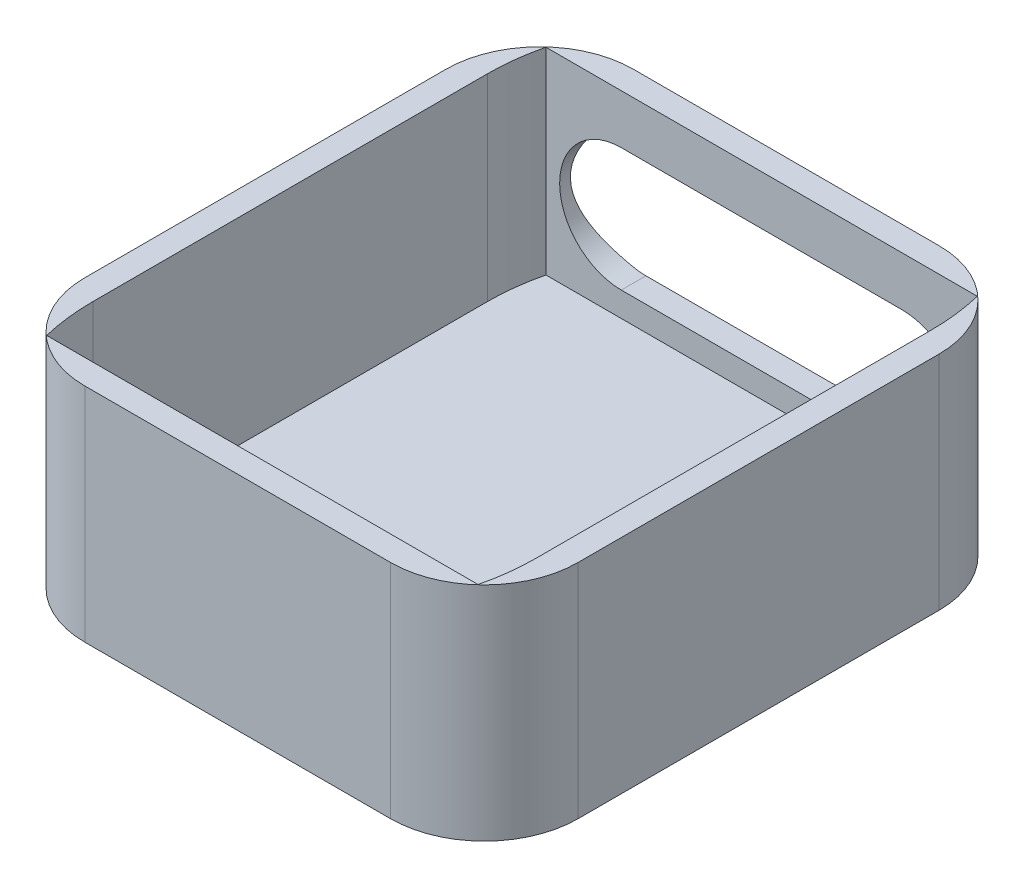
ISO-10303-21;
HEADER;
FILE_DESCRIPTION(('STEP AP214'),'2;1');
FILE_NAME('part.step','',(''),(''),'','','');
FILE_SCHEMA(('AUTOMOTIVE_DESIGN { 1 0 10303 214 1 1 1 1 }'));
ENDSEC;
DATA;
#1=APPLICATION_CONTEXT('core data for automotive mechanical design processes');
#2=APPLICATION_PROTOCOL_DEFINITION('international standard','automotive_design',2000,#1);
#3=PRODUCT_CONTEXT('',#1,'mechanical');
#4=PRODUCT('Part','Part','',(#3));
#5=PRODUCT_RELATED_PRODUCT_CATEGORY('part','',(#4));
#6=PRODUCT_DEFINITION_FORMATION('','',#4);
#7=PRODUCT_DEFINITION_CONTEXT('part definition',#1,'design');
#8=PRODUCT_DEFINITION('design','',#6,#7);
#9=PRODUCT_DEFINITION_SHAPE('','',#8);
#10=(LENGTH_UNIT() NAMED_UNIT(*) SI_UNIT(.MILLI.,.METRE.));
#11=(NAMED_UNIT(*) PLANE_ANGLE_UNIT() SI_UNIT($,.RADIAN.));
#12=(NAMED_UNIT(*) SI_UNIT($,.STERADIAN.) SOLID_ANGLE_UNIT());
#13=UNCERTAINTY_MEASURE_WITH_UNIT(LENGTH_MEASURE(1.E-05),#10,'distance_accuracy_value','');
#14=(GEOMETRIC_REPRESENTATION_CONTEXT(3) GLOBAL_UNCERTAINTY_ASSIGNED_CONTEXT((#13)) GLOBAL_UNIT_ASSIGNED_CONTEXT((#10,
#11,#12)) REPRESENTATION_CONTEXT('',''));
#15=CARTESIAN_POINT('',(0.,0.,0.));
#16=DIRECTION('',(0.,0.,1.));
#17=DIRECTION('',(1.,0.,0.));
#18=AXIS2_PLACEMENT_3D('',#15,#16,#17);
#19=CARTESIAN_POINT('',(0.,114.3,-141.25573728983));
#20=DIRECTION('',(0.,0.,-1.));
#21=DIRECTION('',(-1.,0.,0.));
#22=AXIS2_PLACEMENT_3D('',#19,#20,#21);
#23=PLANE('',#22);
#24=DIRECTION('',(1.,0.,0.));
#25=VECTOR('',#24,1.);
#26=CARTESIAN_POINT('',(0.,114.3,-141.25573728983));
#27=LINE('',#26,#25);
#28=CARTESIAN_POINT('',(-78.74,114.3,-141.25573728983));
#29=VERTEX_POINT('',#28);
#30=CARTESIAN_POINT('',(78.74,114.3,-141.25573728983));
#31=VERTEX_POINT('',#30);
#32=EDGE_CURVE('E340',#29,#31,#27,.T.);
#33=ORIENTED_EDGE('',*,*,#32,.T.);
#34=DIRECTION('',(0.,-1.,0.));
#35=VECTOR('',#34,1.);
#36=CARTESIAN_POINT('',(78.74,0.,-141.25573728983));
#37=LINE('',#36,#35);
#38=CARTESIAN_POINT('',(78.74,88.2335712808609,-141.25573728983));
#39=VERTEX_POINT('',#38);
#40=EDGE_CURVE('E412',#31,#39,#37,.T.);
#41=ORIENTED_EDGE('',*,*,#40,.T.);
#42=CARTESIAN_POINT('',(72.2689802636959,57.15,-141.25573728983));
#43=DIRECTION('',(0.,0.,1.));
#44=DIRECTION('',(1.,0.,0.));
#45=AXIS2_PLACEMENT_3D('',#42,#43,#44);
#46=CIRCLE('',#45,31.75);
#47=CARTESIAN_POINT('',(72.2689802636959,88.9,-141.25573728983));
#48=VERTEX_POINT('',#47);
#49=EDGE_CURVE('E231',#39,#48,#46,.T.);
#50=ORIENTED_EDGE('',*,*,#49,.T.);
#51=DIRECTION('',(1.,0.,0.));
#52=VECTOR('',#51,1.);
#53=CARTESIAN_POINT('',(0.,88.9,-141.25573728983));
#54=LINE('',#53,#52);
#55=CARTESIAN_POINT('',(-72.2689802636959,88.9,-141.25573728983));
#56=VERTEX_POINT('',#55);
#57=EDGE_CURVE('E207',#56,#48,#54,.T.);
#58=ORIENTED_EDGE('',*,*,#57,.F.);
#59=CARTESIAN_POINT('',(-72.2689802636959,57.15,-141.25573728983));
#60=DIRECTION('',(0.,0.,1.));
#61=DIRECTION('',(1.,0.,0.));
#62=AXIS2_PLACEMENT_3D('',#59,#60,#61);
#63=CIRCLE('',#62,31.75);
#64=CARTESIAN_POINT('',(-78.74,88.2335712808609,-141.25573728983));
#65=VERTEX_POINT('',#64);
#66=EDGE_CURVE('E218',#56,#65,#63,.T.);
#67=ORIENTED_EDGE('',*,*,#66,.T.);
#68=DIRECTION('',(0.,-1.,0.));
#69=VECTOR('',#68,1.);
#70=CARTESIAN_POINT('',(-78.74,114.3,-141.25573728983));
#71=LINE('',#70,#69);
#72=EDGE_CURVE('E403',#65,#29,#71,.F.);
#73=ORIENTED_EDGE('',*,*,#72,.T.);
#74=EDGE_LOOP('',(#33,#41,#50,#58,#67,#73));
#75=FACE_BOUND('',#74,.T.);
#76=ADVANCED_FACE('F43',(#75),#23,.T.);
#77=CARTESIAN_POINT('',(72.2689802636959,25.4,-141.25573728983));
#78=VERTEX_POINT('',#77);
#79=CARTESIAN_POINT('',(78.74,26.0664287191391,-141.25573728983));
#80=VERTEX_POINT('',#79);
#81=EDGE_CURVE('E215',#78,#80,#46,.T.);
#82=ORIENTED_EDGE('',*,*,#81,.T.);
#83=DIRECTION('',(0.,-1.,0.));
#84=VECTOR('',#83,1.);
#85=CARTESIAN_POINT('',(78.74,0.,-141.25573728983));
#86=LINE('',#85,#84);
#87=CARTESIAN_POINT('',(78.74,0.,-141.25573728983));
#88=VERTEX_POINT('',#87);
#89=EDGE_CURVE('E409',#80,#88,#86,.T.);
#90=ORIENTED_EDGE('',*,*,#89,.T.);
#91=DIRECTION('',(1.,0.,0.));
#92=VECTOR('',#91,1.);
#93=CARTESIAN_POINT('',(0.,0.,-141.25573728983));
#94=LINE('',#93,#92);
#95=CARTESIAN_POINT('',(-78.74,0.,-141.25573728983));
#96=VERTEX_POINT('',#95);
#97=EDGE_CURVE('E354',#96,#88,#94,.T.);
#98=ORIENTED_EDGE('',*,*,#97,.F.);
#99=DIRECTION('',(0.,-1.,0.));
#100=VECTOR('',#99,1.);
#101=CARTESIAN_POINT('',(-78.74,114.3,-141.25573728983));
#102=LINE('',#101,#100);
#103=CARTESIAN_POINT('',(-78.74,26.066428719139,-141.25573728983));
#104=VERTEX_POINT('',#103);
#105=EDGE_CURVE('E406',#96,#104,#102,.F.);
#106=ORIENTED_EDGE('',*,*,#105,.T.);
#107=CARTESIAN_POINT('',(-72.2689802636959,25.4,-141.25573728983));
#108=VERTEX_POINT('',#107);
#109=EDGE_CURVE('E226',#104,#108,#63,.T.);
#110=ORIENTED_EDGE('',*,*,#109,.T.);
#111=DIRECTION('',(1.,0.,0.));
#112=VECTOR('',#111,1.);
#113=CARTESIAN_POINT('',(0.,25.4,-141.25573728983));
#114=LINE('',#113,#112);
#115=EDGE_CURVE('E225',#108,#78,#114,.T.);
#116=ORIENTED_EDGE('',*,*,#115,.T.);
#117=EDGE_LOOP('',(#82,#90,#98,#106,#110,#116));
#118=FACE_BOUND('',#117,.T.);
#119=ADVANCED_FACE('F457',(#118),#23,.T.);
#120=CARTESIAN_POINT('',(0.,114.3,-128.55573728983));
#121=DIRECTION('',(0.,0.,-1.));
#122=DIRECTION('',(-1.,0.,0.));
#123=AXIS2_PLACEMENT_3D('',#120,#121,#122);
#124=PLANE('',#123);
#125=DIRECTION('',(1.,0.,0.));
#126=VECTOR('',#125,1.);
#127=CARTESIAN_POINT('',(0.,12.7,-128.55573728983));
#128=LINE('',#127,#126);
#129=CARTESIAN_POINT('',(-111.076002030869,12.7,-128.55573728983));
#130=VERTEX_POINT('',#129);
#131=CARTESIAN_POINT('',(111.076002030869,12.7,-128.55573728983));
#132=VERTEX_POINT('',#131);
#133=EDGE_CURVE('E272',#130,#132,#128,.T.);
#134=ORIENTED_EDGE('',*,*,#133,.T.);
#135=DIRECTION('',(0.,-1.,0.));
#136=VECTOR('',#135,1.);
#137=CARTESIAN_POINT('',(111.076002030869,114.3,-128.55573728983));
#138=LINE('',#137,#136);
#139=CARTESIAN_POINT('',(111.076002030869,114.3,-128.55573728983));
#140=VERTEX_POINT('',#139);
#141=EDGE_CURVE('E262',#140,#132,#138,.T.);
#142=ORIENTED_EDGE('',*,*,#141,.F.);
#143=DIRECTION('',(1.,0.,0.));
#144=VECTOR('',#143,1.);
#145=CARTESIAN_POINT('',(0.,114.3,-128.55573728983));
#146=LINE('',#145,#144);
#147=CARTESIAN_POINT('',(-111.076002030869,114.3,-128.55573728983));
#148=VERTEX_POINT('',#147);
#149=EDGE_CURVE('E317',#148,#140,#146,.T.);
#150=ORIENTED_EDGE('',*,*,#149,.F.);
#151=DIRECTION('',(0.,-1.,0.));
#152=VECTOR('',#151,1.);
#153=CARTESIAN_POINT('',(-111.076002030869,114.3,-128.55573728983));
#154=LINE('',#153,#152);
#155=EDGE_CURVE('E275',#148,#130,#154,.T.);
#156=ORIENTED_EDGE('',*,*,#155,.T.);
#157=EDGE_LOOP('',(#134,#142,#150,#156));
#158=FACE_BOUND('',#157,.T.);
#159=DIRECTION('',(-1.,0.,0.));
#160=VECTOR('',#159,1.);
#161=CARTESIAN_POINT('',(0.,88.9,-128.55573728983));
#162=LINE('',#161,#160);
#163=CARTESIAN_POINT('',(72.2689802636959,88.9,-128.55573728983));
#164=VERTEX_POINT('',#163);
#165=CARTESIAN_POINT('',(-72.2689802636959,88.9,-128.55573728983));
#166=VERTEX_POINT('',#165);
#167=EDGE_CURVE('E210',#164,#166,#162,.T.);
#168=ORIENTED_EDGE('',*,*,#167,.F.);
#169=CARTESIAN_POINT('',(72.2689802636959,57.15,-128.55573728983));
#170=DIRECTION('',(0.,0.,-1.));
#171=DIRECTION('',(-1.,0.,0.));
#172=AXIS2_PLACEMENT_3D('',#169,#170,#171);
#173=CIRCLE('',#172,31.75);
#174=CARTESIAN_POINT('',(72.2689802636959,25.4,-128.55573728983));
#175=VERTEX_POINT('',#174);
#176=EDGE_CURVE('E371',#164,#175,#173,.T.);
#177=ORIENTED_EDGE('',*,*,#176,.T.);
#178=DIRECTION('',(-1.,0.,0.));
#179=VECTOR('',#178,1.);
#180=CARTESIAN_POINT('',(0.,25.4,-128.55573728983));
#181=LINE('',#180,#179);
#182=CARTESIAN_POINT('',(-72.2689802636959,25.4,-128.55573728983));
#183=VERTEX_POINT('',#182);
#184=EDGE_CURVE('E367',#175,#183,#181,.T.);
#185=ORIENTED_EDGE('',*,*,#184,.T.);
#186=CARTESIAN_POINT('',(-72.2689802636959,57.15,-128.55573728983));
#187=DIRECTION('',(0.,0.,-1.));
#188=DIRECTION('',(-1.,0.,0.));
#189=AXIS2_PLACEMENT_3D('',#186,#187,#188);
#190=CIRCLE('',#189,31.75);
#191=EDGE_CURVE('E351',#183,#166,#190,.T.);
#192=ORIENTED_EDGE('',*,*,#191,.T.);
#193=EDGE_LOOP('',(#168,#177,#185,#192));
#194=FACE_BOUND('',#193,.T.);
#195=ADVANCED_FACE('F453',(#158,#194),#124,.F.);
#196=CARTESIAN_POINT('',(127.,114.3,0.));
#197=DIRECTION('',(-1.,0.,0.));
#198=DIRECTION('',(0.,0.,1.));
#199=AXIS2_PLACEMENT_3D('',#196,#197,#198);
#200=PLANE('',#199);
#201=DIRECTION('',(0.,0.,-1.));
#202=VECTOR('',#201,1.);
#203=CARTESIAN_POINT('',(127.,0.,0.));
#204=LINE('',#203,#202);
#205=CARTESIAN_POINT('',(127.,0.,92.9957372898298));
#206=VERTEX_POINT('',#205);
#207=CARTESIAN_POINT('',(127.,0.,-92.9957372898298));
#208=VERTEX_POINT('',#207);
#209=EDGE_CURVE('E261',#206,#208,#204,.T.);
#210=ORIENTED_EDGE('',*,*,#209,.T.);
#211=DIRECTION('',(0.,-1.,0.));
#212=VECTOR('',#211,1.);
#213=CARTESIAN_POINT('',(127.,114.3,-92.9957372898298));
#214=LINE('',#213,#212);
#215=CARTESIAN_POINT('',(127.,114.3,-92.9957372898298));
#216=VERTEX_POINT('',#215);
#217=EDGE_CURVE('E73',#208,#216,#214,.F.);
#218=ORIENTED_EDGE('',*,*,#217,.T.);
#219=DIRECTION('',(0.,0.,-1.));
#220=VECTOR('',#219,1.);
#221=CARTESIAN_POINT('',(127.,114.3,0.));
#222=LINE('',#221,#220);
#223=CARTESIAN_POINT('',(127.,114.3,92.9957372898298));
#224=VERTEX_POINT('',#223);
#225=EDGE_CURVE('E337',#224,#216,#222,.T.);
#226=ORIENTED_EDGE('',*,*,#225,.F.);
#227=DIRECTION('',(0.,-1.,0.));
#228=VECTOR('',#227,1.);
#229=CARTESIAN_POINT('',(127.,114.3,92.9957372898298));
#230=LINE('',#229,#228);
#231=EDGE_CURVE('E377',#224,#206,#230,.T.);
#232=ORIENTED_EDGE('',*,*,#231,.T.);
#233=EDGE_LOOP('',(#210,#218,#226,#232));
#234=FACE_BOUND('',#233,.T.);
#235=ADVANCED_FACE('F456',(#234),#200,.F.);
#236=CARTESIAN_POINT('',(-127.,114.3,0.));
#237=DIRECTION('',(-1.,0.,0.));
#238=DIRECTION('',(0.,0.,1.));
#239=AXIS2_PLACEMENT_3D('',#236,#237,#238);
#240=PLANE('',#239);
#241=DIRECTION('',(0.,0.,-1.));
#242=VECTOR('',#241,1.);
#243=CARTESIAN_POINT('',(-127.,114.3,0.));
#244=LINE('',#243,#242);
#245=CARTESIAN_POINT('',(-127.,114.3,92.9957372898299));
#246=VERTEX_POINT('',#245);
#247=CARTESIAN_POINT('',(-127.,114.3,-92.9957372898298));
#248=VERTEX_POINT('',#247);
#249=EDGE_CURVE('E344',#246,#248,#244,.T.);
#250=ORIENTED_EDGE('',*,*,#249,.T.);
#251=DIRECTION('',(0.,-1.,0.));
#252=VECTOR('',#251,1.);
#253=CARTESIAN_POINT('',(-127.,114.3,-92.9957372898298));
#254=LINE('',#253,#252);
#255=CARTESIAN_POINT('',(-127.,0.,-92.9957372898298));
#256=VERTEX_POINT('',#255);
#257=EDGE_CURVE('E58',#248,#256,#254,.T.);
#258=ORIENTED_EDGE('',*,*,#257,.T.);
#259=DIRECTION('',(0.,0.,-1.));
#260=VECTOR('',#259,1.);
#261=CARTESIAN_POINT('',(-127.,0.,0.));
#262=LINE('',#261,#260);
#263=CARTESIAN_POINT('',(-127.,0.,92.9957372898299));
#264=VERTEX_POINT('',#263);
#265=EDGE_CURVE('E358',#264,#256,#262,.T.);
#266=ORIENTED_EDGE('',*,*,#265,.F.);
#267=DIRECTION('',(0.,-1.,0.));
#268=VECTOR('',#267,1.);
#269=CARTESIAN_POINT('',(-127.,114.3,92.9957372898299));
#270=LINE('',#269,#268);
#271=EDGE_CURVE('E400',#264,#246,#270,.F.);
#272=ORIENTED_EDGE('',*,*,#271,.T.);
#273=EDGE_LOOP('',(#250,#258,#266,#272));
#274=FACE_BOUND('',#273,.T.);
#275=ADVANCED_FACE('F485',(#274),#240,.T.);
#276=CARTESIAN_POINT('',(0.,114.3,141.25573728983));
#277=DIRECTION('',(0.,0.,-1.));
#278=DIRECTION('',(-1.,0.,0.));
#279=AXIS2_PLACEMENT_3D('',#276,#277,#278);
#280=PLANE('',#279);
#281=DIRECTION('',(1.,0.,0.));
#282=VECTOR('',#281,1.);
#283=CARTESIAN_POINT('',(0.,0.,141.25573728983));
#284=LINE('',#283,#282);
#285=CARTESIAN_POINT('',(-78.74,0.,141.25573728983));
#286=VERTEX_POINT('',#285);
#287=CARTESIAN_POINT('',(78.74,0.,141.25573728983));
#288=VERTEX_POINT('',#287);
#289=EDGE_CURVE('E341',#286,#288,#284,.T.);
#290=ORIENTED_EDGE('',*,*,#289,.T.);
#291=DIRECTION('',(0.,-1.,0.));
#292=VECTOR('',#291,1.);
#293=CARTESIAN_POINT('',(78.74,114.3,141.25573728983));
#294=LINE('',#293,#292);
#295=CARTESIAN_POINT('',(78.74,114.3,141.25573728983));
#296=VERTEX_POINT('',#295);
#297=EDGE_CURVE('E391',#288,#296,#294,.F.);
#298=ORIENTED_EDGE('',*,*,#297,.T.);
#299=DIRECTION('',(1.,0.,0.));
#300=VECTOR('',#299,1.);
#301=CARTESIAN_POINT('',(0.,114.3,141.25573728983));
#302=LINE('',#301,#300);
#303=CARTESIAN_POINT('',(-78.74,114.3,141.25573728983));
#304=VERTEX_POINT('',#303);
#305=EDGE_CURVE('E347',#304,#296,#302,.T.);
#306=ORIENTED_EDGE('',*,*,#305,.F.);
#307=DIRECTION('',(0.,-1.,0.));
#308=VECTOR('',#307,1.);
#309=CARTESIAN_POINT('',(-78.74,0.,141.25573728983));
#310=LINE('',#309,#308);
#311=EDGE_CURVE('E387',#304,#286,#310,.T.);
#312=ORIENTED_EDGE('',*,*,#311,.T.);
#313=EDGE_LOOP('',(#290,#298,#306,#312));
#314=FACE_BOUND('',#313,.T.);
#315=ADVANCED_FACE('F478',(#314),#280,.F.);
#316=CARTESIAN_POINT('',(0.,114.3,0.));
#317=DIRECTION('',(0.,1.,0.));
#318=DIRECTION('',(0.,0.,1.));
#319=AXIS2_PLACEMENT_3D('',#316,#317,#318);
#320=PLANE('',#319);
#321=DIRECTION('',(0.,0.,-1.));
#322=VECTOR('',#321,1.);
#323=CARTESIAN_POINT('',(114.3,114.3,0.));
#324=LINE('',#323,#322);
#325=CARTESIAN_POINT('',(114.3,114.3,101.6));
#326=VERTEX_POINT('',#325);
#327=CARTESIAN_POINT('',(114.3,114.3,-101.6));
#328=VERTEX_POINT('',#327);
#329=EDGE_CURVE('E311',#326,#328,#324,.T.);
#330=ORIENTED_EDGE('',*,*,#329,.F.);
#331=CARTESIAN_POINT('',(0.,114.3,101.6));
#332=DIRECTION('',(0.,1.,0.));
#333=DIRECTION('',(0.,0.,1.));
#334=AXIS2_PLACEMENT_3D('',#331,#332,#333);
#335=CIRCLE('',#334,114.3);
#336=CARTESIAN_POINT('',(111.076002030869,114.3,128.55573728983));
#337=VERTEX_POINT('',#336);
#338=EDGE_CURVE('E268',#337,#326,#335,.T.);
#339=ORIENTED_EDGE('',*,*,#338,.F.);
#340=DIRECTION('',(1.,0.,0.));
#341=VECTOR('',#340,1.);
#342=CARTESIAN_POINT('',(0.,114.3,128.55573728983));
#343=LINE('',#342,#341);
#344=CARTESIAN_POINT('',(-111.076002030869,114.3,128.55573728983));
#345=VERTEX_POINT('',#344);
#346=EDGE_CURVE('E331',#345,#337,#343,.T.);
#347=ORIENTED_EDGE('',*,*,#346,.F.);
#348=CARTESIAN_POINT('',(0.,114.3,101.6));
#349=DIRECTION('',(0.,1.,0.));
#350=DIRECTION('',(0.,0.,1.));
#351=AXIS2_PLACEMENT_3D('',#348,#349,#350);
#352=CIRCLE('',#351,114.3);
#353=CARTESIAN_POINT('',(-114.3,114.3,101.6));
#354=VERTEX_POINT('',#353);
#355=EDGE_CURVE('E328',#354,#345,#352,.T.);
#356=ORIENTED_EDGE('',*,*,#355,.F.);
#357=DIRECTION('',(0.,0.,-1.));
#358=VECTOR('',#357,1.);
#359=CARTESIAN_POINT('',(-114.3,114.3,0.));
#360=LINE('',#359,#358);
#361=CARTESIAN_POINT('',(-114.3,114.3,-101.6));
#362=VERTEX_POINT('',#361);
#363=EDGE_CURVE('E324',#354,#362,#360,.T.);
#364=ORIENTED_EDGE('',*,*,#363,.T.);
#365=CARTESIAN_POINT('',(0.,114.3,-101.6));
#366=DIRECTION('',(0.,1.,0.));
#367=DIRECTION('',(0.,0.,1.));
#368=AXIS2_PLACEMENT_3D('',#365,#366,#367);
#369=CIRCLE('',#368,114.3);
#370=EDGE_CURVE('E321',#148,#362,#369,.T.);
#371=ORIENTED_EDGE('',*,*,#370,.F.);
#372=ORIENTED_EDGE('',*,*,#149,.T.);
#373=CARTESIAN_POINT('',(0.,114.3,-101.6));
#374=DIRECTION('',(0.,1.,0.));
#375=DIRECTION('',(0.,0.,1.));
#376=AXIS2_PLACEMENT_3D('',#373,#374,#375);
#377=CIRCLE('',#376,114.3);
#378=EDGE_CURVE('E314',#328,#140,#377,.T.);
#379=ORIENTED_EDGE('',*,*,#378,.F.);
#380=EDGE_LOOP('',(#330,#339,#347,#356,#364,#371,#372,#379));
#381=FACE_BOUND('',#380,.T.);
#382=ORIENTED_EDGE('',*,*,#225,.T.);
#383=CARTESIAN_POINT('',(78.74,114.3,-92.9957372898298));
#384=DIRECTION('',(0.,1.,0.));
#385=DIRECTION('',(0.,0.,1.));
#386=AXIS2_PLACEMENT_3D('',#383,#384,#385);
#387=CIRCLE('',#386,48.26);
#388=EDGE_CURVE('E618',#216,#31,#387,.T.);
#389=ORIENTED_EDGE('',*,*,#388,.T.);
#390=ORIENTED_EDGE('',*,*,#32,.F.);
#391=CARTESIAN_POINT('',(-78.74,114.3,-92.9957372898298));
#392=DIRECTION('',(0.,1.,0.));
#393=DIRECTION('',(0.,0.,1.));
#394=AXIS2_PLACEMENT_3D('',#391,#392,#393);
#395=CIRCLE('',#394,48.26);
#396=EDGE_CURVE('E65',#29,#248,#395,.T.);
#397=ORIENTED_EDGE('',*,*,#396,.T.);
#398=ORIENTED_EDGE('',*,*,#249,.F.);
#399=CARTESIAN_POINT('',(-78.74,114.3,92.9957372898299));
#400=DIRECTION('',(0.,1.,0.));
#401=DIRECTION('',(0.,0.,1.));
#402=AXIS2_PLACEMENT_3D('',#399,#400,#401);
#403=CIRCLE('',#402,48.26);
#404=EDGE_CURVE('E394',#246,#304,#403,.T.);
#405=ORIENTED_EDGE('',*,*,#404,.T.);
#406=ORIENTED_EDGE('',*,*,#305,.T.);
#407=CARTESIAN_POINT('',(78.74,114.3,92.9957372898298));
#408=DIRECTION('',(0.,1.,0.));
#409=DIRECTION('',(0.,0.,1.));
#410=AXIS2_PLACEMENT_3D('',#407,#408,#409);
#411=CIRCLE('',#410,48.26);
#412=EDGE_CURVE('E397',#296,#224,#411,.T.);
#413=ORIENTED_EDGE('',*,*,#412,.T.);
#414=EDGE_LOOP('',(#382,#389,#390,#397,#398,#405,#406,#413));
#415=FACE_BOUND('',#414,.T.);
#416=ADVANCED_FACE('F475',(#381,#415),#320,.T.);
#417=CARTESIAN_POINT('',(0.,0.,0.));
#418=DIRECTION('',(0.,1.,0.));
#419=DIRECTION('',(0.,0.,1.));
#420=AXIS2_PLACEMENT_3D('',#417,#418,#419);
#421=PLANE('',#420);
#422=ORIENTED_EDGE('',*,*,#97,.T.);
#423=CARTESIAN_POINT('',(78.74,0.,-92.9957372898298));
#424=DIRECTION('',(0.,1.,0.));
#425=DIRECTION('',(0.,0.,1.));
#426=AXIS2_PLACEMENT_3D('',#423,#424,#425);
#427=CIRCLE('',#426,48.26);
#428=EDGE_CURVE('E627',#88,#208,#427,.F.);
#429=ORIENTED_EDGE('',*,*,#428,.T.);
#430=ORIENTED_EDGE('',*,*,#209,.F.);
#431=CARTESIAN_POINT('',(78.74,0.,92.9957372898298));
#432=DIRECTION('',(0.,1.,0.));
#433=DIRECTION('',(0.,0.,1.));
#434=AXIS2_PLACEMENT_3D('',#431,#432,#433);
#435=CIRCLE('',#434,48.26);
#436=EDGE_CURVE('E384',#206,#288,#435,.F.);
#437=ORIENTED_EDGE('',*,*,#436,.T.);
#438=ORIENTED_EDGE('',*,*,#289,.F.);
#439=CARTESIAN_POINT('',(-78.74,0.,92.9957372898299));
#440=DIRECTION('',(0.,1.,0.));
#441=DIRECTION('',(0.,0.,1.));
#442=AXIS2_PLACEMENT_3D('',#439,#440,#441);
#443=CIRCLE('',#442,48.26);
#444=EDGE_CURVE('E381',#286,#264,#443,.F.);
#445=ORIENTED_EDGE('',*,*,#444,.T.);
#446=ORIENTED_EDGE('',*,*,#265,.T.);
#447=CARTESIAN_POINT('',(-78.74,0.,-92.9957372898298));
#448=DIRECTION('',(0.,1.,0.));
#449=DIRECTION('',(0.,0.,1.));
#450=AXIS2_PLACEMENT_3D('',#447,#448,#449);
#451=CIRCLE('',#450,48.26);
#452=EDGE_CURVE('E423',#256,#96,#451,.F.);
#453=ORIENTED_EDGE('',*,*,#452,.T.);
#454=EDGE_LOOP('',(#422,#429,#430,#437,#438,#445,#446,#453));
#455=FACE_BOUND('',#454,.T.);
#456=ADVANCED_FACE('F447',(#455),#421,.F.);
#457=CARTESIAN_POINT('',(114.3,114.3,0.));
#458=DIRECTION('',(-1.,0.,0.));
#459=DIRECTION('',(0.,0.,1.));
#460=AXIS2_PLACEMENT_3D('',#457,#458,#459);
#461=PLANE('',#460);
#462=DIRECTION('',(0.,0.,-1.));
#463=VECTOR('',#462,1.);
#464=CARTESIAN_POINT('',(114.3,12.7,0.));
#465=LINE('',#464,#463);
#466=CARTESIAN_POINT('',(114.3,12.7,101.6));
#467=VERTEX_POINT('',#466);
#468=CARTESIAN_POINT('',(114.3,12.7,-101.6));
#469=VERTEX_POINT('',#468);
#470=EDGE_CURVE('E245',#467,#469,#465,.T.);
#471=ORIENTED_EDGE('',*,*,#470,.F.);
#472=DIRECTION('',(0.,1.,0.));
#473=VECTOR('',#472,1.);
#474=CARTESIAN_POINT('',(114.3,114.3,101.6));
#475=LINE('',#474,#473);
#476=EDGE_CURVE('E263',#326,#467,#475,.F.);
#477=ORIENTED_EDGE('',*,*,#476,.F.);
#478=ORIENTED_EDGE('',*,*,#329,.T.);
#479=DIRECTION('',(0.,-1.,0.));
#480=VECTOR('',#479,1.);
#481=CARTESIAN_POINT('',(114.3,114.3,-101.6));
#482=LINE('',#481,#480);
#483=EDGE_CURVE('E257',#328,#469,#482,.T.);
#484=ORIENTED_EDGE('',*,*,#483,.T.);
#485=EDGE_LOOP('',(#471,#477,#478,#484));
#486=FACE_BOUND('',#485,.T.);
#487=ADVANCED_FACE('F443',(#486),#461,.T.);
#488=CARTESIAN_POINT('',(0.,114.3,-101.6));
#489=DIRECTION('',(0.,-1.,0.));
#490=DIRECTION('',(0.,0.,-1.));
#491=AXIS2_PLACEMENT_3D('',#488,#489,#490);
#492=CYLINDRICAL_SURFACE('',#491,114.3);
#493=CARTESIAN_POINT('',(0.,12.7,-101.6));
#494=DIRECTION('',(0.,1.,0.));
#495=DIRECTION('',(0.,0.,1.));
#496=AXIS2_PLACEMENT_3D('',#493,#494,#495);
#497=CIRCLE('',#496,114.3);
#498=EDGE_CURVE('E256',#469,#132,#497,.T.);
#499=ORIENTED_EDGE('',*,*,#498,.F.);
#500=ORIENTED_EDGE('',*,*,#483,.F.);
#501=ORIENTED_EDGE('',*,*,#378,.T.);
#502=ORIENTED_EDGE('',*,*,#141,.T.);
#503=EDGE_LOOP('',(#499,#500,#501,#502));
#504=FACE_BOUND('',#503,.T.);
#505=ADVANCED_FACE('F446',(#504),#492,.F.);
#506=CARTESIAN_POINT('',(0.,12.7,-101.6));
#507=DIRECTION('',(0.,1.,0.));
#508=DIRECTION('',(0.,0.,1.));
#509=AXIS2_PLACEMENT_3D('',#506,#507,#508);
#510=CIRCLE('',#509,114.3);
#511=CARTESIAN_POINT('',(-114.3,12.7,-101.6));
#512=VERTEX_POINT('',#511);
#513=EDGE_CURVE('E279',#130,#512,#510,.T.);
#514=ORIENTED_EDGE('',*,*,#513,.F.);
#515=ORIENTED_EDGE('',*,*,#155,.F.);
#516=ORIENTED_EDGE('',*,*,#370,.T.);
#517=DIRECTION('',(0.,1.,0.));
#518=VECTOR('',#517,1.);
#519=CARTESIAN_POINT('',(-114.3,114.3,-101.6));
#520=LINE('',#519,#518);
#521=EDGE_CURVE('E282',#362,#512,#520,.F.);
#522=ORIENTED_EDGE('',*,*,#521,.T.);
#523=EDGE_LOOP('',(#514,#515,#516,#522));
#524=FACE_BOUND('',#523,.T.);
#525=ADVANCED_FACE('F451',(#524),#492,.F.);
#526=CARTESIAN_POINT('',(-114.3,114.3,0.));
#527=DIRECTION('',(-1.,0.,0.));
#528=DIRECTION('',(0.,0.,1.));
#529=AXIS2_PLACEMENT_3D('',#526,#527,#528);
#530=PLANE('',#529);
#531=DIRECTION('',(0.,0.,-1.));
#532=VECTOR('',#531,1.);
#533=CARTESIAN_POINT('',(-114.3,12.7,0.));
#534=LINE('',#533,#532);
#535=CARTESIAN_POINT('',(-114.3,12.7,101.6));
#536=VERTEX_POINT('',#535);
#537=EDGE_CURVE('E286',#536,#512,#534,.T.);
#538=ORIENTED_EDGE('',*,*,#537,.T.);
#539=ORIENTED_EDGE('',*,*,#521,.F.);
#540=ORIENTED_EDGE('',*,*,#363,.F.);
#541=DIRECTION('',(0.,-1.,0.));
#542=VECTOR('',#541,1.);
#543=CARTESIAN_POINT('',(-114.3,114.3,101.6));
#544=LINE('',#543,#542);
#545=EDGE_CURVE('E289',#354,#536,#544,.T.);
#546=ORIENTED_EDGE('',*,*,#545,.T.);
#547=EDGE_LOOP('',(#538,#539,#540,#546));
#548=FACE_BOUND('',#547,.T.);
#549=ADVANCED_FACE('F459',(#548),#530,.F.);
#550=CARTESIAN_POINT('',(0.,114.3,101.6));
#551=DIRECTION('',(0.,-1.,0.));
#552=DIRECTION('',(0.,0.,-1.));
#553=AXIS2_PLACEMENT_3D('',#550,#551,#552);
#554=CYLINDRICAL_SURFACE('',#553,114.3);
#555=CARTESIAN_POINT('',(0.,12.7,101.6));
#556=DIRECTION('',(0.,1.,0.));
#557=DIRECTION('',(0.,0.,1.));
#558=AXIS2_PLACEMENT_3D('',#555,#556,#557);
#559=CIRCLE('',#558,114.3);
#560=CARTESIAN_POINT('',(-111.076002030869,12.7,128.55573728983));
#561=VERTEX_POINT('',#560);
#562=EDGE_CURVE('E293',#536,#561,#559,.T.);
#563=ORIENTED_EDGE('',*,*,#562,.F.);
#564=ORIENTED_EDGE('',*,*,#545,.F.);
#565=ORIENTED_EDGE('',*,*,#355,.T.);
#566=DIRECTION('',(0.,-1.,0.));
#567=VECTOR('',#566,1.);
#568=CARTESIAN_POINT('',(-111.076002030869,114.3,128.55573728983));
#569=LINE('',#568,#567);
#570=EDGE_CURVE('E296',#345,#561,#569,.T.);
#571=ORIENTED_EDGE('',*,*,#570,.T.);
#572=EDGE_LOOP('',(#563,#564,#565,#571));
#573=FACE_BOUND('',#572,.T.);
#574=ADVANCED_FACE('F462',(#573),#554,.F.);
#575=CARTESIAN_POINT('',(0.,114.3,128.55573728983));
#576=DIRECTION('',(0.,0.,-1.));
#577=DIRECTION('',(-1.,0.,0.));
#578=AXIS2_PLACEMENT_3D('',#575,#576,#577);
#579=PLANE('',#578);
#580=DIRECTION('',(1.,0.,0.));
#581=VECTOR('',#580,1.);
#582=CARTESIAN_POINT('',(0.,12.7,128.55573728983));
#583=LINE('',#582,#581);
#584=CARTESIAN_POINT('',(111.076002030869,12.7,128.55573728983));
#585=VERTEX_POINT('',#584);
#586=EDGE_CURVE('E299',#561,#585,#583,.T.);
#587=ORIENTED_EDGE('',*,*,#586,.F.);
#588=ORIENTED_EDGE('',*,*,#570,.F.);
#589=ORIENTED_EDGE('',*,*,#346,.T.);
#590=DIRECTION('',(0.,-1.,0.));
#591=VECTOR('',#590,1.);
#592=CARTESIAN_POINT('',(111.076002030869,114.3,128.55573728983));
#593=LINE('',#592,#591);
#594=EDGE_CURVE('E267',#337,#585,#593,.T.);
#595=ORIENTED_EDGE('',*,*,#594,.T.);
#596=EDGE_LOOP('',(#587,#588,#589,#595));
#597=FACE_BOUND('',#596,.T.);
#598=ADVANCED_FACE('F466',(#597),#579,.T.);
#599=CARTESIAN_POINT('',(0.,12.7,101.6));
#600=DIRECTION('',(0.,1.,0.));
#601=DIRECTION('',(0.,0.,1.));
#602=AXIS2_PLACEMENT_3D('',#599,#600,#601);
#603=CIRCLE('',#602,114.3);
#604=EDGE_CURVE('E305',#585,#467,#603,.T.);
#605=ORIENTED_EDGE('',*,*,#604,.F.);
#606=ORIENTED_EDGE('',*,*,#594,.F.);
#607=ORIENTED_EDGE('',*,*,#338,.T.);
#608=ORIENTED_EDGE('',*,*,#476,.T.);
#609=EDGE_LOOP('',(#605,#606,#607,#608));
#610=FACE_BOUND('',#609,.T.);
#611=ADVANCED_FACE('F468',(#610),#554,.F.);
#612=CARTESIAN_POINT('',(0.,12.7,0.));
#613=DIRECTION('',(0.,1.,0.));
#614=DIRECTION('',(0.,0.,1.));
#615=AXIS2_PLACEMENT_3D('',#612,#613,#614);
#616=PLANE('',#615);
#617=ORIENTED_EDGE('',*,*,#470,.T.);
#618=ORIENTED_EDGE('',*,*,#498,.T.);
#619=ORIENTED_EDGE('',*,*,#133,.F.);
#620=ORIENTED_EDGE('',*,*,#513,.T.);
#621=ORIENTED_EDGE('',*,*,#537,.F.);
#622=ORIENTED_EDGE('',*,*,#562,.T.);
#623=ORIENTED_EDGE('',*,*,#586,.T.);
#624=ORIENTED_EDGE('',*,*,#604,.T.);
#625=EDGE_LOOP('',(#617,#618,#619,#620,#621,#622,#623,#624));
#626=FACE_BOUND('',#625,.T.);
#627=ADVANCED_FACE('F442',(#626),#616,.T.);
#628=CARTESIAN_POINT('',(0.,88.9,-141.25573728983));
#629=DIRECTION('',(0.,-1.,0.));
#630=DIRECTION('',(0.,0.,-1.));
#631=AXIS2_PLACEMENT_3D('',#628,#629,#630);
#632=PLANE('',#631);
#633=ORIENTED_EDGE('',*,*,#167,.T.);
#634=DIRECTION('',(0.,0.,1.));
#635=VECTOR('',#634,1.);
#636=CARTESIAN_POINT('',(-72.2689802636959,88.9,-141.25573728983));
#637=LINE('',#636,#635);
#638=EDGE_CURVE('E202',#56,#166,#637,.T.);
#639=ORIENTED_EDGE('',*,*,#638,.F.);
#640=ORIENTED_EDGE('',*,*,#57,.T.);
#641=DIRECTION('',(0.,0.,1.));
#642=VECTOR('',#641,1.);
#643=CARTESIAN_POINT('',(72.2689802636959,88.9,-141.25573728983));
#644=LINE('',#643,#642);
#645=EDGE_CURVE('E242',#48,#164,#644,.T.);
#646=ORIENTED_EDGE('',*,*,#645,.T.);
#647=EDGE_LOOP('',(#633,#639,#640,#646));
#648=FACE_BOUND('',#647,.T.);
#649=ADVANCED_FACE('F204',(#648),#632,.T.);
#650=CARTESIAN_POINT('',(72.2689802636959,57.15,-141.25573728983));
#651=DIRECTION('',(0.,0.,1.));
#652=DIRECTION('',(1.,0.,0.));
#653=AXIS2_PLACEMENT_3D('',#650,#651,#652);
#654=CYLINDRICAL_SURFACE('',#653,31.75);
#655=ORIENTED_EDGE('',*,*,#49,.F.);
#656=CARTESIAN_POINT('',(78.74,88.2335712808609,-141.25573728983));
#657=CARTESIAN_POINT('',(79.147547518729,88.1487380651767,-141.255748100767));
#658=CARTESIAN_POINT('',(79.5534090708512,88.055872369736,-141.25057504943));
#659=CARTESIAN_POINT('',(80.3609048133495,87.8543358548126,-141.230196946859));
#660=CARTESIAN_POINT('',(80.7625393080721,87.7456661816745,-141.214992622963));
#661=CARTESIAN_POINT('',(81.5604905799555,87.5128550266169,-141.174902388377));
#662=CARTESIAN_POINT('',(81.9568110593852,87.3887250106359,-141.150023623877));
#663=CARTESIAN_POINT('',(82.7436379321462,87.1252605652706,-141.090999091674));
#664=CARTESIAN_POINT('',(83.1341442419485,86.9859259176886,-141.056853190972));
#665=CARTESIAN_POINT('',(84.2912072688862,86.5473772412613,-140.941639700231));
#666=CARTESIAN_POINT('',(85.0482915922865,86.2261604825114,-140.847535439099));
#667=CARTESIAN_POINT('',(86.5316194478271,85.5280205021757,-140.628508097517));
#668=CARTESIAN_POINT('',(87.2578580392691,85.1510883994099,-140.503580101549));
#669=CARTESIAN_POINT('',(88.6734283720678,84.3459141933008,-140.227856658307));
#670=CARTESIAN_POINT('',(89.3628556907806,83.9178153550612,-140.077132949073));
#671=CARTESIAN_POINT('',(90.7035244164815,83.0127974301792,-139.75444943981));
#672=CARTESIAN_POINT('',(91.3547670703832,82.5358799390995,-139.582490333789));
#673=CARTESIAN_POINT('',(92.6173888883272,81.5355398963267,-139.22210871566));
#674=CARTESIAN_POINT('',(93.2287022342968,81.0120437615397,-139.033660162249));
#675=CARTESIAN_POINT('',(94.4080368359395,79.9221206260264,-138.645771580054));
#676=CARTESIAN_POINT('',(94.9760554584095,79.3556910182405,-138.446330883993));
#677=CARTESIAN_POINT('',(96.1155110330648,78.1301503364684,-138.023736162541));
#678=CARTESIAN_POINT('',(96.6827155632443,77.4672804922531,-137.80005594967));
#679=CARTESIAN_POINT('',(97.7607884865779,76.0970382429391,-137.353124358227));
#680=CARTESIAN_POINT('',(98.2716538794173,75.3896634708982,-137.129873003115));
#681=CARTESIAN_POINT('',(99.2346199121001,73.9332974263626,-136.691026067582));
#682=CARTESIAN_POINT('',(99.686699130289,73.1842911244874,-136.47543329863));
#683=CARTESIAN_POINT('',(100.529060747432,71.6481941904022,-136.059471000908));
#684=CARTESIAN_POINT('',(100.919342016505,70.861102862209,-135.859101750511));
#685=CARTESIAN_POINT('',(101.651927691674,69.214597644011,-135.472212146107));
#686=CARTESIAN_POINT('',(101.991098448307,68.3535236346508,-135.286791718267));
#687=CARTESIAN_POINT('',(102.594530773227,66.599018203788,-134.949386526778));
#688=CARTESIAN_POINT('',(102.858789843639,65.7055857044352,-134.797402878093));
#689=CARTESIAN_POINT('',(103.308360988927,63.8945092228792,-134.534768502894));
#690=CARTESIAN_POINT('',(103.493793499166,62.9769044670973,-134.424054754156));
#691=CARTESIAN_POINT('',(103.783161164745,61.1245553688763,-134.24978618052));
#692=CARTESIAN_POINT('',(103.88711214049,60.1898143896826,-134.186222201182));
#693=CARTESIAN_POINT('',(104.003615075465,58.4335506736022,-134.114845767194));
#694=CARTESIAN_POINT('',(104.026201034623,57.6129252523692,-134.100915358195));
#695=CARTESIAN_POINT('',(104.007741037688,55.9727025213852,-134.112267675298));
#696=CARTESIAN_POINT('',(103.966700642642,55.1531051280486,-134.137546974407));
#697=CARTESIAN_POINT('',(103.821592574485,53.5214691357352,-134.226168278543));
#698=CARTESIAN_POINT('',(103.717512303208,52.709432080594,-134.289517891687));
#699=CARTESIAN_POINT('',(103.447777476077,51.0992557623,-134.451472576163));
#700=CARTESIAN_POINT('',(103.282121987276,50.3011167099122,-134.550078181668));
#701=CARTESIAN_POINT('',(102.902921987481,48.7709680617218,-134.771638768933));
#702=CARTESIAN_POINT('',(102.692799992992,48.0378437096434,-134.892802995463));
#703=CARTESIAN_POINT('',(102.221927789221,46.5924848173555,-135.158513365137));
#704=CARTESIAN_POINT('',(101.96118050635,45.8802490724114,-135.30305815668));
#705=CARTESIAN_POINT('',(101.391104875351,44.4797176791371,-135.610991948302));
#706=CARTESIAN_POINT('',(101.08177462013,43.7914229718937,-135.774381688062));
#707=CARTESIAN_POINT('',(100.416405589806,42.4410980908327,-136.115347885582));
#708=CARTESIAN_POINT('',(100.060345744158,41.7790799416525,-136.292930728857));
#709=CARTESIAN_POINT('',(99.254873424259,40.4006584895449,-136.68088533671));
#710=CARTESIAN_POINT('',(98.7993447202496,39.6881837875518,-136.892539773004));
#711=CARTESIAN_POINT('',(97.8339694226381,38.3030826666402,-137.320975089486));
#712=CARTESIAN_POINT('',(97.3241400272124,37.6304437352969,-137.537754329715));
#713=CARTESIAN_POINT('',(96.2516945490215,36.3268133033899,-137.970205472471));
#714=CARTESIAN_POINT('',(95.6890163118403,35.6958723662999,-138.185875748388));
#715=CARTESIAN_POINT('',(94.5136985260655,34.4795288960193,-138.609422173895));
#716=CARTESIAN_POINT('',(93.9010583644704,33.8941269217356,-138.817298227809));
#717=CARTESIAN_POINT('',(92.5716067523525,32.7221628669803,-139.236868383123));
#718=CARTESIAN_POINT('',(91.8503764786993,32.1401280980384,-139.447257768128));
#719=CARTESIAN_POINT('',(90.35515337976,31.0384065405672,-139.843512485293));
#720=CARTESIAN_POINT('',(89.5811505492981,30.5187316267085,-140.029373147321));
#721=CARTESIAN_POINT('',(87.9870146640557,29.5479245318424,-140.368542012534));
#722=CARTESIAN_POINT('',(87.1669953855066,29.0966326906974,-140.521926384746));
#723=CARTESIAN_POINT('',(85.4855452009027,28.2663811882988,-140.789558752204));
#724=CARTESIAN_POINT('',(84.6241399457324,27.8873774290591,-140.903830641312));
#725=CARTESIAN_POINT('',(82.9358746111469,27.2328913367973,-141.079875923222));
#726=CARTESIAN_POINT('',(82.1116336701169,26.9516081855279,-141.145074059433));
#727=CARTESIAN_POINT('',(80.8586809941578,26.5809053458845,-141.21102599728));
#728=CARTESIAN_POINT('',(80.4382072382559,26.4658626906939,-141.227702532368));
#729=CARTESIAN_POINT('',(79.5924586704726,26.2530843789888,-141.250063837984));
#730=CARTESIAN_POINT('',(79.1671822241398,26.1553548155856,-141.255744745701));
#731=CARTESIAN_POINT('',(78.74,26.0664287191391,-141.25573728983));
#732=B_SPLINE_CURVE_WITH_KNOTS('',3,(#656,#657,#658,#659,#660,#661,#662,#663,#664,#665,#666,
#667,#668,#669,#670,#671,#672,#673,#674,#675,#676,#677,#678,#679,#680,#681,#682,#683,#684,#685,
#686,#687,#688,#689,#690,#691,#692,#693,#694,#695,#696,#697,#698,#699,#700,#701,#702,#703,#704,
#705,#706,#707,#708,#709,#710,#711,#712,#713,#714,#715,#716,#717,#718,#719,#720,#721,#722,#723,
#724,#725,#726,#727,#728,#729,#730,#731),.UNSPECIFIED.,.F.,.F.,(4,2,2,2,2,2,2,2,2,2,2,2,2,2,2,2,
2,2,2,2,2,2,2,2,2,2,2,2,2,2,2,2,2,2,2,2,2,4),(0.,1.24871466835146,2.49733880607393,
3.74504237316376,4.99276384806707,7.47266553519382,9.95296295266178,12.426471518669,
14.8998992676416,17.3773062742235,19.8548638376922,22.5538698897962,25.2530196068865,
27.9531501529362,30.653330061049,33.4809475511822,36.3086593150683,39.132035087591,
41.9548625393382,44.4147082786685,46.8743390356411,49.3344614982588,51.7946212365193,
54.1088872506916,56.4230195278035,58.7372426674713,61.0525129073304,63.6650088255857,
66.2766797579549,68.8914616286921,71.5062755860006,74.3536453150071,77.201556387515,
80.0427121862535,82.882129208696,85.4980120006683,86.8063052717301,88.1150580683577),.UNSPECIFIED.);
#733=EDGE_CURVE('E415',#39,#80,#732,.T.);
#734=ORIENTED_EDGE('',*,*,#733,.T.);
#735=ORIENTED_EDGE('',*,*,#81,.F.);
#736=DIRECTION('',(0.,0.,1.));
#737=VECTOR('',#736,1.);
#738=CARTESIAN_POINT('',(72.2689802636959,25.4,-141.25573728983));
#739=LINE('',#738,#737);
#740=EDGE_CURVE('E246',#78,#175,#739,.T.);
#741=ORIENTED_EDGE('',*,*,#740,.T.);
#742=ORIENTED_EDGE('',*,*,#176,.F.);
#743=ORIENTED_EDGE('',*,*,#645,.F.);
#744=EDGE_LOOP('',(#655,#734,#735,#741,#742,#743));
#745=FACE_BOUND('',#744,.T.);
#746=ADVANCED_FACE('F428',(#745),#654,.F.);
#747=CARTESIAN_POINT('',(0.,25.4,-141.25573728983));
#748=DIRECTION('',(0.,-1.,0.));
#749=DIRECTION('',(1.,0.,0.));
#750=AXIS2_PLACEMENT_3D('',#747,#748,#749);
#751=PLANE('',#750);
#752=ORIENTED_EDGE('',*,*,#740,.F.);
#753=ORIENTED_EDGE('',*,*,#115,.F.);
#754=DIRECTION('',(0.,0.,1.));
#755=VECTOR('',#754,1.);
#756=CARTESIAN_POINT('',(-72.2689802636959,25.4,-141.25573728983));
#757=LINE('',#756,#755);
#758=EDGE_CURVE('E214',#108,#183,#757,.T.);
#759=ORIENTED_EDGE('',*,*,#758,.T.);
#760=ORIENTED_EDGE('',*,*,#184,.F.);
#761=EDGE_LOOP('',(#752,#753,#759,#760));
#762=FACE_BOUND('',#761,.T.);
#763=ADVANCED_FACE('F432',(#762),#751,.F.);
#764=CARTESIAN_POINT('',(-72.2689802636959,57.15,-141.25573728983));
#765=DIRECTION('',(0.,0.,1.));
#766=DIRECTION('',(1.,0.,0.));
#767=AXIS2_PLACEMENT_3D('',#764,#765,#766);
#768=CYLINDRICAL_SURFACE('',#767,31.75);
#769=ORIENTED_EDGE('',*,*,#109,.F.);
#770=CARTESIAN_POINT('',(-78.74,26.066428719139,-141.25573728983));
#771=CARTESIAN_POINT('',(-79.1475475187291,26.1512619348233,-141.255748100767));
#772=CARTESIAN_POINT('',(-79.5534090708513,26.2441276302639,-141.25057504943));
#773=CARTESIAN_POINT('',(-80.3609048133496,26.4456641451873,-141.230196946859));
#774=CARTESIAN_POINT('',(-80.7625393080722,26.5543338183255,-141.214992622963));
#775=CARTESIAN_POINT('',(-81.5604905799555,26.7871449733831,-141.174902388377));
#776=CARTESIAN_POINT('',(-81.9568110593852,26.911274989364,-141.150023623877));
#777=CARTESIAN_POINT('',(-82.7436379321463,27.1747394347294,-141.090999091674));
#778=CARTESIAN_POINT('',(-83.1341442419486,27.3140740823114,-141.056853190972));
#779=CARTESIAN_POINT('',(-84.2912072688862,27.7526227587387,-140.941639700231));
#780=CARTESIAN_POINT('',(-85.0482915922866,28.0738395174886,-140.847535439099));
#781=CARTESIAN_POINT('',(-86.5316194478271,28.7719794978243,-140.628508097517));
#782=CARTESIAN_POINT('',(-87.2578580392691,29.1489116005901,-140.503580101549));
#783=CARTESIAN_POINT('',(-88.6734283720678,29.9540858066992,-140.227856658307));
#784=CARTESIAN_POINT('',(-89.3628556907807,30.3821846449388,-140.077132949073));
#785=CARTESIAN_POINT('',(-90.7035244164816,31.2872025698208,-139.75444943981));
#786=CARTESIAN_POINT('',(-91.3547670703833,31.7641200609005,-139.582490333789));
#787=CARTESIAN_POINT('',(-92.6173888883273,32.7644601036733,-139.22210871566));
#788=CARTESIAN_POINT('',(-93.2287022342968,33.2879562384603,-139.033660162249));
#789=CARTESIAN_POINT('',(-94.4080368359395,34.3778793739736,-138.645771580054));
#790=CARTESIAN_POINT('',(-94.9760554584096,34.9443089817595,-138.446330883993));
#791=CARTESIAN_POINT('',(-96.1155110330648,36.1698496635316,-138.023736162541));
#792=CARTESIAN_POINT('',(-96.6827155632443,36.8327195077469,-137.80005594967));
#793=CARTESIAN_POINT('',(-97.760788486578,38.2029617570609,-137.353124358227));
#794=CARTESIAN_POINT('',(-98.2716538794174,38.9103365291018,-137.129873003115));
#795=CARTESIAN_POINT('',(-99.2346199121002,40.3667025736374,-136.691026067583));
#796=CARTESIAN_POINT('',(-99.686699130289,41.1157088755126,-136.47543329863));
#797=CARTESIAN_POINT('',(-100.529060747432,42.6518058095978,-136.059471000908));
#798=CARTESIAN_POINT('',(-100.919342016505,43.438897137791,-135.859101750511));
#799=CARTESIAN_POINT('',(-101.651927691674,45.085402355989,-135.472212146107));
#800=CARTESIAN_POINT('',(-101.991098448307,45.9464763653492,-135.286791718267));
#801=CARTESIAN_POINT('',(-102.594530773227,47.700981796212,-134.949386526778));
#802=CARTESIAN_POINT('',(-102.858789843639,48.5944142955648,-134.797402878093));
#803=CARTESIAN_POINT('',(-103.308360988927,50.4054907771208,-134.534768502894));
#804=CARTESIAN_POINT('',(-103.493793499166,51.3230955329027,-134.424054754156));
#805=CARTESIAN_POINT('',(-103.783161164745,53.1754446311237,-134.24978618052));
#806=CARTESIAN_POINT('',(-103.88711214049,54.1101856103175,-134.186222201182));
#807=CARTESIAN_POINT('',(-104.003615075465,55.8664493263978,-134.114845767194));
#808=CARTESIAN_POINT('',(-104.026201034623,56.6870747476308,-134.100915358195));
#809=CARTESIAN_POINT('',(-104.007741037688,58.3272974786149,-134.112267675298));
#810=CARTESIAN_POINT('',(-103.966700642642,59.1468948719514,-134.137546974407));
#811=CARTESIAN_POINT('',(-103.821592574485,60.7785308642648,-134.226168278543));
#812=CARTESIAN_POINT('',(-103.717512303208,61.590567919406,-134.289517891687));
#813=CARTESIAN_POINT('',(-103.447777476077,63.2007442377,-134.451472576163));
#814=CARTESIAN_POINT('',(-103.282121987276,63.9988832900878,-134.550078181668));
#815=CARTESIAN_POINT('',(-102.902921987481,65.5290319382783,-134.771638768933));
#816=CARTESIAN_POINT('',(-102.692799992992,66.2621562903566,-134.892802995463));
#817=CARTESIAN_POINT('',(-102.221927789221,67.7075151826445,-135.158513365137));
#818=CARTESIAN_POINT('',(-101.96118050635,68.4197509275886,-135.30305815668));
#819=CARTESIAN_POINT('',(-101.391104875351,69.8202823208629,-135.610991948302));
#820=CARTESIAN_POINT('',(-101.08177462013,70.5085770281064,-135.774381688062));
#821=CARTESIAN_POINT('',(-100.416405589806,71.8589019091674,-136.115347885582));
#822=CARTESIAN_POINT('',(-100.060345744158,72.5209200583475,-136.292930728857));
#823=CARTESIAN_POINT('',(-99.254873424259,73.8993415104551,-136.68088533671));
#824=CARTESIAN_POINT('',(-98.7993447202495,74.6118162124482,-136.892539773004));
#825=CARTESIAN_POINT('',(-97.833969422638,75.9969173333598,-137.320975089486));
#826=CARTESIAN_POINT('',(-97.3241400272123,76.6695562647031,-137.537754329716));
#827=CARTESIAN_POINT('',(-96.2516945490215,77.9731866966101,-137.970205472471));
#828=CARTESIAN_POINT('',(-95.6890163118403,78.6041276337001,-138.185875748389));
#829=CARTESIAN_POINT('',(-94.5136985260655,79.8204711039807,-138.609422173895));
#830=CARTESIAN_POINT('',(-93.9010583644704,80.4058730782644,-138.817298227809));
#831=CARTESIAN_POINT('',(-92.5716067523524,81.5778371330197,-139.236868383123));
#832=CARTESIAN_POINT('',(-91.8503764786992,82.1598719019616,-139.447257768128));
#833=CARTESIAN_POINT('',(-90.35515337976,83.2615934594328,-139.843512485293));
#834=CARTESIAN_POINT('',(-89.581150549298,83.7812683732915,-140.029373147321));
#835=CARTESIAN_POINT('',(-87.9870146640557,84.7520754681576,-140.368542012534));
#836=CARTESIAN_POINT('',(-87.1669953855065,85.2033673093026,-140.521926384746));
#837=CARTESIAN_POINT('',(-85.4855452009027,86.0336188117012,-140.789558752204));
#838=CARTESIAN_POINT('',(-84.6241399457324,86.4126225709409,-140.903830641312));
#839=CARTESIAN_POINT('',(-82.9358746111469,87.0671086632027,-141.079875923222));
#840=CARTESIAN_POINT('',(-82.1116336701169,87.348391814472,-141.145074059433));
#841=CARTESIAN_POINT('',(-80.8586809941578,87.7190946541155,-141.21102599728));
#842=CARTESIAN_POINT('',(-80.438207238256,87.8341373093061,-141.227702532368));
#843=CARTESIAN_POINT('',(-79.5924586704727,88.0469156210112,-141.250063837984));
#844=CARTESIAN_POINT('',(-79.1671822241398,88.1446451844144,-141.255744745701));
#845=CARTESIAN_POINT('',(-78.74,88.2335712808609,-141.25573728983));
#846=B_SPLINE_CURVE_WITH_KNOTS('',3,(#770,#771,#772,#773,#774,#775,#776,#777,#778,#779,#780,
#781,#782,#783,#784,#785,#786,#787,#788,#789,#790,#791,#792,#793,#794,#795,#796,#797,#798,#799,
#800,#801,#802,#803,#804,#805,#806,#807,#808,#809,#810,#811,#812,#813,#814,#815,#816,#817,#818,
#819,#820,#821,#822,#823,#824,#825,#826,#827,#828,#829,#830,#831,#832,#833,#834,#835,#836,#837,
#838,#839,#840,#841,#842,#843,#844,#845),.UNSPECIFIED.,.F.,.F.,(4,2,2,2,2,2,2,2,2,2,2,2,2,2,2,2,
2,2,2,2,2,2,2,2,2,2,2,2,2,2,2,2,2,2,2,2,2,4),(0.,1.24871466835146,2.49733880607393,
3.74504237316376,4.99276384806707,7.47266553519383,9.95296295266179,12.426471518669,
14.8998992676416,17.3773062742235,19.8548638376922,22.5538698897962,25.2530196068865,
27.9531501529362,30.653330061049,33.4809475511822,36.3086593150683,39.132035087591,
41.9548625393382,44.4147082786685,46.8743390356411,49.3344614982588,51.7946212365193,
54.1088872506916,56.4230195278035,58.7372426674713,61.0525129073304,63.6650088255857,
66.2766797579549,68.8914616286921,71.5062755860007,74.3536453150072,77.2015563875151,
80.0427121862536,82.882129208696,85.4980120006682,86.80630527173,88.1150580683577),.UNSPECIFIED.);
#847=EDGE_CURVE('E11',#104,#65,#846,.T.);
#848=ORIENTED_EDGE('',*,*,#847,.T.);
#849=ORIENTED_EDGE('',*,*,#66,.F.);
#850=ORIENTED_EDGE('',*,*,#638,.T.);
#851=ORIENTED_EDGE('',*,*,#191,.F.);
#852=ORIENTED_EDGE('',*,*,#758,.F.);
#853=EDGE_LOOP('',(#769,#848,#849,#850,#851,#852));
#854=FACE_BOUND('',#853,.T.);
#855=ADVANCED_FACE('F220',(#854),#768,.F.);
#856=CARTESIAN_POINT('',(78.74,114.3,92.9957372898298));
#857=DIRECTION('',(0.,-1.,0.));
#858=DIRECTION('',(0.,0.,-1.));
#859=AXIS2_PLACEMENT_3D('',#856,#857,#858);
#860=CYLINDRICAL_SURFACE('',#859,48.26);
#861=ORIENTED_EDGE('',*,*,#412,.F.);
#862=ORIENTED_EDGE('',*,*,#297,.F.);
#863=ORIENTED_EDGE('',*,*,#436,.F.);
#864=ORIENTED_EDGE('',*,*,#231,.F.);
#865=EDGE_LOOP('',(#861,#862,#863,#864));
#866=FACE_BOUND('',#865,.T.);
#867=ADVANCED_FACE('F439',(#866),#860,.T.);
#868=CARTESIAN_POINT('',(-78.74,114.3,92.9957372898299));
#869=DIRECTION('',(0.,1.,0.));
#870=DIRECTION('',(0.,0.,1.));
#871=AXIS2_PLACEMENT_3D('',#868,#869,#870);
#872=CYLINDRICAL_SURFACE('',#871,48.26);
#873=ORIENTED_EDGE('',*,*,#404,.F.);
#874=ORIENTED_EDGE('',*,*,#271,.F.);
#875=ORIENTED_EDGE('',*,*,#444,.F.);
#876=ORIENTED_EDGE('',*,*,#311,.F.);
#877=EDGE_LOOP('',(#873,#874,#875,#876));
#878=FACE_BOUND('',#877,.T.);
#879=ADVANCED_FACE('F496',(#878),#872,.T.);
#880=CARTESIAN_POINT('',(78.74,114.3,-92.9957372898298));
#881=DIRECTION('',(0.,1.,0.));
#882=DIRECTION('',(0.,0.,1.));
#883=AXIS2_PLACEMENT_3D('',#880,#881,#882);
#884=CYLINDRICAL_SURFACE('',#883,48.26);
#885=ORIENTED_EDGE('',*,*,#388,.F.);
#886=ORIENTED_EDGE('',*,*,#217,.F.);
#887=ORIENTED_EDGE('',*,*,#428,.F.);
#888=ORIENTED_EDGE('',*,*,#89,.F.);
#889=ORIENTED_EDGE('',*,*,#733,.F.);
#890=ORIENTED_EDGE('',*,*,#40,.F.);
#891=EDGE_LOOP('',(#885,#886,#887,#888,#889,#890));
#892=FACE_BOUND('',#891,.T.);
#893=ADVANCED_FACE('F425',(#892),#884,.T.);
#894=CARTESIAN_POINT('',(-78.74,114.3,-92.9957372898298));
#895=DIRECTION('',(0.,-1.,0.));
#896=DIRECTION('',(0.,0.,-1.));
#897=AXIS2_PLACEMENT_3D('',#894,#895,#896);
#898=CYLINDRICAL_SURFACE('',#897,48.26);
#899=ORIENTED_EDGE('',*,*,#847,.F.);
#900=ORIENTED_EDGE('',*,*,#105,.F.);
#901=ORIENTED_EDGE('',*,*,#452,.F.);
#902=ORIENTED_EDGE('',*,*,#257,.F.);
#903=ORIENTED_EDGE('',*,*,#396,.F.);
#904=ORIENTED_EDGE('',*,*,#72,.F.);
#905=EDGE_LOOP('',(#899,#900,#901,#902,#903,#904));
#906=FACE_BOUND('',#905,.T.);
#907=ADVANCED_FACE('F45',(#906),#898,.T.);
#908=CLOSED_SHELL('',(#76,#119,#195,#235,#275,#315,#416,#456,#487,#505,#525,#549,#574,#598,#611,
#627,#649,#746,#763,#855,#867,#879,#893,#907));
#909=MANIFOLD_SOLID_BREP('B2',#908);
#910=ADVANCED_BREP_SHAPE_REPRESENTATION('',(#18,#909),#14);
#911=SHAPE_DEFINITION_REPRESENTATION(#9,#910);
ENDSEC;
END-ISO-10303-21;
